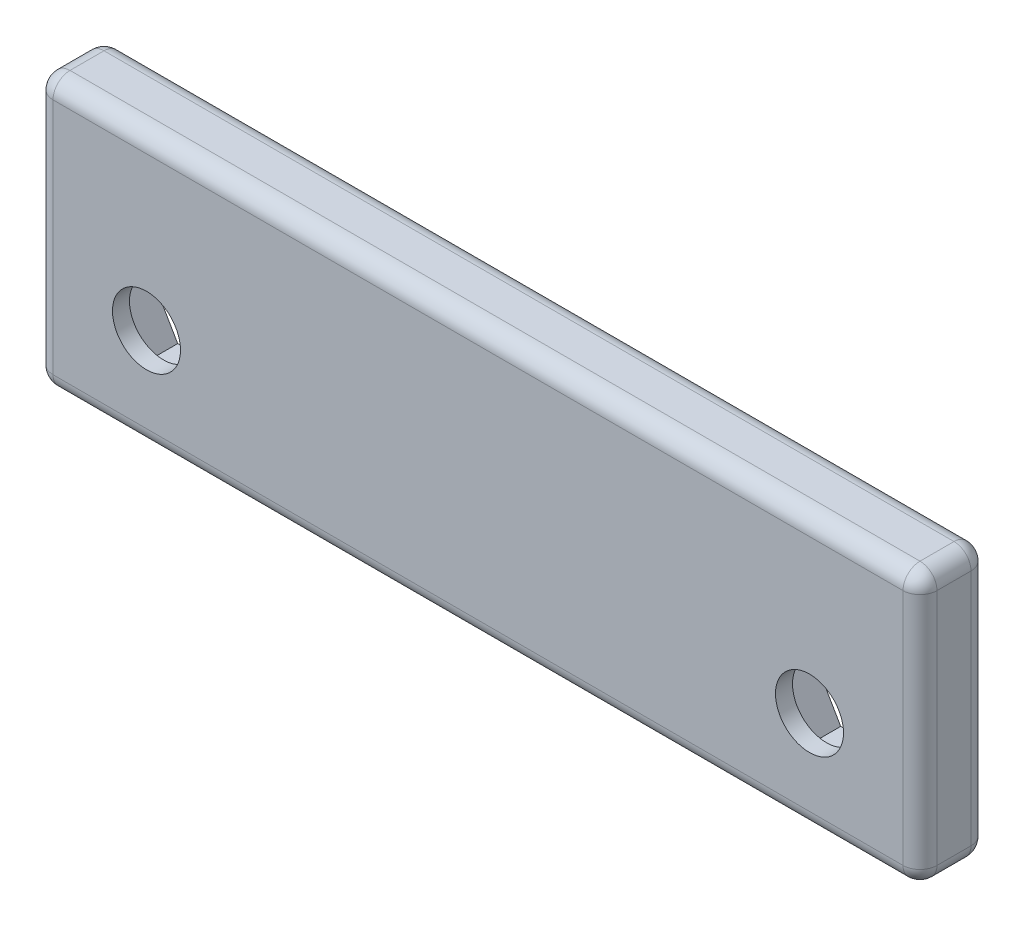
ISO-10303-21;
HEADER;
FILE_DESCRIPTION(('STEP AP214'),'2;1');
FILE_NAME('part.step','',(''),(''),'','','');
FILE_SCHEMA(('AUTOMOTIVE_DESIGN { 1 0 10303 214 1 1 1 1 }'));
ENDSEC;
DATA;
#1=APPLICATION_CONTEXT('core data for automotive mechanical design processes');
#2=APPLICATION_PROTOCOL_DEFINITION('international standard','automotive_design',2000,#1);
#3=PRODUCT_CONTEXT('',#1,'mechanical');
#4=PRODUCT('Part','Part','',(#3));
#5=PRODUCT_RELATED_PRODUCT_CATEGORY('part','',(#4));
#6=PRODUCT_DEFINITION_FORMATION('','',#4);
#7=PRODUCT_DEFINITION_CONTEXT('part definition',#1,'design');
#8=PRODUCT_DEFINITION('design','',#6,#7);
#9=PRODUCT_DEFINITION_SHAPE('','',#8);
#10=(LENGTH_UNIT() NAMED_UNIT(*) SI_UNIT(.MILLI.,.METRE.));
#11=(NAMED_UNIT(*) PLANE_ANGLE_UNIT() SI_UNIT($,.RADIAN.));
#12=(NAMED_UNIT(*) SI_UNIT($,.STERADIAN.) SOLID_ANGLE_UNIT());
#13=UNCERTAINTY_MEASURE_WITH_UNIT(LENGTH_MEASURE(1.E-05),#10,'distance_accuracy_value','');
#14=(GEOMETRIC_REPRESENTATION_CONTEXT(3) GLOBAL_UNCERTAINTY_ASSIGNED_CONTEXT((#13)) GLOBAL_UNIT_ASSIGNED_CONTEXT((#10,
#11,#12)) REPRESENTATION_CONTEXT('',''));
#15=CARTESIAN_POINT('',(0.,0.,0.));
#16=DIRECTION('',(0.,0.,1.));
#17=DIRECTION('',(1.,0.,0.));
#18=AXIS2_PLACEMENT_3D('',#15,#16,#17);
#19=CARTESIAN_POINT('',(-5.64474689882211,-0.29828109962315,4.));
#20=DIRECTION('',(0.,0.,-1.));
#21=DIRECTION('',(-1.,0.,0.));
#22=AXIS2_PLACEMENT_3D('',#19,#20,#21);
#23=CYLINDRICAL_SURFACE('',#22,2.);
#24=CARTESIAN_POINT('',(-5.64474689882211,-0.29828109962315,4.));
#25=DIRECTION('',(0.,0.,1.));
#26=DIRECTION('',(1.,0.,0.));
#27=AXIS2_PLACEMENT_3D('',#24,#25,#26);
#28=CIRCLE('',#27,2.);
#29=CARTESIAN_POINT('',(-3.64474689882211,-0.29828109962315,4.));
#30=VERTEX_POINT('',#29);
#31=EDGE_CURVE('E300',#30,#30,#28,.T.);
#32=ORIENTED_EDGE('',*,*,#31,.T.);
#33=EDGE_LOOP('',(#32));
#34=FACE_BOUND('',#33,.T.);
#35=CARTESIAN_POINT('',(-5.64474689882211,-0.29828109962315,3.));
#36=DIRECTION('',(0.,0.,-1.));
#37=DIRECTION('',(-1.,0.,0.));
#38=AXIS2_PLACEMENT_3D('',#35,#36,#37);
#39=CIRCLE('',#38,2.);
#40=CARTESIAN_POINT('',(-7.64474689882211,-0.29828109962315,3.));
#41=VERTEX_POINT('',#40);
#42=EDGE_CURVE('E37',#41,#41,#39,.T.);
#43=ORIENTED_EDGE('',*,*,#42,.T.);
#44=EDGE_LOOP('',(#43));
#45=FACE_BOUND('',#44,.T.);
#46=ADVANCED_FACE('F33',(#34,#45),#23,.F.);
#47=CARTESIAN_POINT('',(33.3552531011779,-0.298281099623149,4.));
#48=DIRECTION('',(0.,0.,-1.));
#49=DIRECTION('',(-1.,0.,0.));
#50=AXIS2_PLACEMENT_3D('',#47,#48,#49);
#51=CYLINDRICAL_SURFACE('',#50,2.);
#52=CARTESIAN_POINT('',(33.3552531011779,-0.298281099623149,4.));
#53=DIRECTION('',(0.,0.,1.));
#54=DIRECTION('',(1.,0.,0.));
#55=AXIS2_PLACEMENT_3D('',#52,#53,#54);
#56=CIRCLE('',#55,2.);
#57=CARTESIAN_POINT('',(35.3552531011779,-0.298281099623149,4.));
#58=VERTEX_POINT('',#57);
#59=EDGE_CURVE('E297',#58,#58,#56,.T.);
#60=ORIENTED_EDGE('',*,*,#59,.T.);
#61=EDGE_LOOP('',(#60));
#62=FACE_BOUND('',#61,.T.);
#63=CARTESIAN_POINT('',(33.3552531011779,-0.298281099623149,3.));
#64=DIRECTION('',(0.,0.,-1.));
#65=DIRECTION('',(-1.,0.,0.));
#66=AXIS2_PLACEMENT_3D('',#63,#64,#65);
#67=CIRCLE('',#66,2.);
#68=CARTESIAN_POINT('',(31.3552531011779,-0.298281099623149,3.));
#69=VERTEX_POINT('',#68);
#70=EDGE_CURVE('E287',#69,#69,#67,.T.);
#71=ORIENTED_EDGE('',*,*,#70,.T.);
#72=EDGE_LOOP('',(#71));
#73=FACE_BOUND('',#72,.T.);
#74=ADVANCED_FACE('F422',(#62,#73),#51,.F.);
#75=CARTESIAN_POINT('',(0.,0.,4.));
#76=DIRECTION('',(0.,0.,1.));
#77=DIRECTION('',(1.,0.,0.));
#78=AXIS2_PLACEMENT_3D('',#75,#76,#77);
#79=PLANE('',#78);
#80=DIRECTION('',(-1.,0.,0.));
#81=VECTOR('',#80,1.);
#82=CARTESIAN_POINT('',(-12.1447468988221,8.70171890037685,4.));
#83=LINE('',#82,#81);
#84=CARTESIAN_POINT('',(38.8552531011779,8.70171890037685,4.));
#85=VERTEX_POINT('',#84);
#86=CARTESIAN_POINT('',(-11.1447468988221,8.70171890037685,4.));
#87=VERTEX_POINT('',#86);
#88=EDGE_CURVE('E331',#85,#87,#83,.T.);
#89=ORIENTED_EDGE('',*,*,#88,.T.);
#90=DIRECTION('',(0.,-1.,0.));
#91=VECTOR('',#90,1.);
#92=CARTESIAN_POINT('',(-11.1447468988221,-6.29828109962315,4.));
#93=LINE('',#92,#91);
#94=CARTESIAN_POINT('',(-11.1447468988221,-5.29828109962315,4.));
#95=VERTEX_POINT('',#94);
#96=EDGE_CURVE('E337',#87,#95,#93,.T.);
#97=ORIENTED_EDGE('',*,*,#96,.T.);
#98=DIRECTION('',(1.,0.,0.));
#99=VECTOR('',#98,1.);
#100=CARTESIAN_POINT('',(39.8552531011779,-5.29828109962315,4.));
#101=LINE('',#100,#99);
#102=CARTESIAN_POINT('',(38.8552531011779,-5.29828109962315,4.));
#103=VERTEX_POINT('',#102);
#104=EDGE_CURVE('E335',#95,#103,#101,.T.);
#105=ORIENTED_EDGE('',*,*,#104,.T.);
#106=DIRECTION('',(0.,1.,0.));
#107=VECTOR('',#106,1.);
#108=CARTESIAN_POINT('',(38.8552531011779,9.70171890037685,4.));
#109=LINE('',#108,#107);
#110=EDGE_CURVE('E333',#103,#85,#109,.T.);
#111=ORIENTED_EDGE('',*,*,#110,.T.);
#112=EDGE_LOOP('',(#89,#97,#105,#111));
#113=FACE_BOUND('',#112,.T.);
#114=ORIENTED_EDGE('',*,*,#31,.F.);
#115=EDGE_LOOP('',(#114));
#116=FACE_BOUND('',#115,.T.);
#117=ORIENTED_EDGE('',*,*,#59,.F.);
#118=EDGE_LOOP('',(#117));
#119=FACE_BOUND('',#118,.T.);
#120=ADVANCED_FACE('F455',(#113,#116,#119),#79,.T.);
#121=CARTESIAN_POINT('',(0.,0.,0.));
#122=DIRECTION('',(0.,0.,1.));
#123=DIRECTION('',(1.,0.,0.));
#124=AXIS2_PLACEMENT_3D('',#121,#122,#123);
#125=PLANE('',#124);
#126=DIRECTION('',(-0.5,-0.866025403784439,0.));
#127=VECTOR('',#126,1.);
#128=CARTESIAN_POINT('',(-1.31461987989992,-0.298281099623151,0.));
#129=LINE('',#128,#127);
#130=CARTESIAN_POINT('',(-1.31461987989992,-0.298281099623151,0.));
#131=VERTEX_POINT('',#130);
#132=CARTESIAN_POINT('',(-3.47968338936101,-4.04828109962315,0.));
#133=VERTEX_POINT('',#132);
#134=EDGE_CURVE('E231',#131,#133,#129,.T.);
#135=ORIENTED_EDGE('',*,*,#134,.F.);
#136=DIRECTION('',(0.5,-0.866025403784439,0.));
#137=VECTOR('',#136,1.);
#138=CARTESIAN_POINT('',(-3.47968338936101,3.45171890037685,0.));
#139=LINE('',#138,#137);
#140=CARTESIAN_POINT('',(-3.47968338936101,3.45171890037685,0.));
#141=VERTEX_POINT('',#140);
#142=EDGE_CURVE('E50',#141,#131,#139,.T.);
#143=ORIENTED_EDGE('',*,*,#142,.F.);
#144=DIRECTION('',(1.,0.,0.));
#145=VECTOR('',#144,1.);
#146=CARTESIAN_POINT('',(-7.8098104082832,3.45171890037685,0.));
#147=LINE('',#146,#145);
#148=CARTESIAN_POINT('',(-7.8098104082832,3.45171890037685,0.));
#149=VERTEX_POINT('',#148);
#150=EDGE_CURVE('E217',#149,#141,#147,.T.);
#151=ORIENTED_EDGE('',*,*,#150,.F.);
#152=DIRECTION('',(0.5,0.866025403784439,0.));
#153=VECTOR('',#152,1.);
#154=CARTESIAN_POINT('',(-9.9748739177443,-0.298281099623149,0.));
#155=LINE('',#154,#153);
#156=CARTESIAN_POINT('',(-9.9748739177443,-0.298281099623149,0.));
#157=VERTEX_POINT('',#156);
#158=EDGE_CURVE('E220',#157,#149,#155,.T.);
#159=ORIENTED_EDGE('',*,*,#158,.F.);
#160=DIRECTION('',(-0.5,0.866025403784439,0.));
#161=VECTOR('',#160,1.);
#162=CARTESIAN_POINT('',(-7.8098104082832,-4.04828109962315,0.));
#163=LINE('',#162,#161);
#164=CARTESIAN_POINT('',(-7.8098104082832,-4.04828109962315,0.));
#165=VERTEX_POINT('',#164);
#166=EDGE_CURVE('E236',#165,#157,#163,.T.);
#167=ORIENTED_EDGE('',*,*,#166,.F.);
#168=DIRECTION('',(-1.,0.,0.));
#169=VECTOR('',#168,1.);
#170=CARTESIAN_POINT('',(-3.47968338936101,-4.04828109962315,0.));
#171=LINE('',#170,#169);
#172=EDGE_CURVE('E233',#133,#165,#171,.T.);
#173=ORIENTED_EDGE('',*,*,#172,.F.);
#174=EDGE_LOOP('',(#135,#143,#151,#159,#167,#173));
#175=FACE_BOUND('',#174,.T.);
#176=DIRECTION('',(0.5,0.866025403784439,0.));
#177=VECTOR('',#176,1.);
#178=CARTESIAN_POINT('',(29.0251260822557,-0.298281099623142,0.));
#179=LINE('',#178,#177);
#180=CARTESIAN_POINT('',(29.0251260822557,-0.298281099623142,0.));
#181=VERTEX_POINT('',#180);
#182=CARTESIAN_POINT('',(31.1901895917168,3.45171890037685,0.));
#183=VERTEX_POINT('',#182);
#184=EDGE_CURVE('E271',#181,#183,#179,.T.);
#185=ORIENTED_EDGE('',*,*,#184,.F.);
#186=DIRECTION('',(-0.499999999999999,0.866025403784439,0.));
#187=VECTOR('',#186,1.);
#188=CARTESIAN_POINT('',(31.1901895917168,-4.04828109962314,0.));
#189=LINE('',#188,#187);
#190=CARTESIAN_POINT('',(31.1901895917168,-4.04828109962314,0.));
#191=VERTEX_POINT('',#190);
#192=EDGE_CURVE('E58',#191,#181,#189,.T.);
#193=ORIENTED_EDGE('',*,*,#192,.F.);
#194=DIRECTION('',(-1.,0.,0.));
#195=VECTOR('',#194,1.);
#196=CARTESIAN_POINT('',(35.520316610639,-4.04828109962314,0.));
#197=LINE('',#196,#195);
#198=CARTESIAN_POINT('',(35.520316610639,-4.04828109962314,0.));
#199=VERTEX_POINT('',#198);
#200=EDGE_CURVE('E254',#199,#191,#197,.T.);
#201=ORIENTED_EDGE('',*,*,#200,.F.);
#202=DIRECTION('',(-0.5,-0.866025403784439,0.));
#203=VECTOR('',#202,1.);
#204=CARTESIAN_POINT('',(37.6853801201001,-0.298281099623148,0.));
#205=LINE('',#204,#203);
#206=CARTESIAN_POINT('',(37.6853801201001,-0.298281099623148,0.));
#207=VERTEX_POINT('',#206);
#208=EDGE_CURVE('E280',#207,#199,#205,.T.);
#209=ORIENTED_EDGE('',*,*,#208,.F.);
#210=DIRECTION('',(0.5,-0.866025403784439,0.));
#211=VECTOR('',#210,1.);
#212=CARTESIAN_POINT('',(35.520316610639,3.45171890037685,0.));
#213=LINE('',#212,#211);
#214=CARTESIAN_POINT('',(35.520316610639,3.45171890037685,0.));
#215=VERTEX_POINT('',#214);
#216=EDGE_CURVE('E277',#215,#207,#213,.T.);
#217=ORIENTED_EDGE('',*,*,#216,.F.);
#218=DIRECTION('',(1.,0.,0.));
#219=VECTOR('',#218,1.);
#220=CARTESIAN_POINT('',(31.1901895917168,3.45171890037685,0.));
#221=LINE('',#220,#219);
#222=EDGE_CURVE('E274',#183,#215,#221,.T.);
#223=ORIENTED_EDGE('',*,*,#222,.F.);
#224=EDGE_LOOP('',(#185,#193,#201,#209,#217,#223));
#225=FACE_BOUND('',#224,.T.);
#226=DIRECTION('',(1.,0.,0.));
#227=VECTOR('',#226,1.);
#228=CARTESIAN_POINT('',(0.,-5.29828109962315,0.));
#229=LINE('',#228,#227);
#230=CARTESIAN_POINT('',(38.8552531011779,-5.29828109962315,0.));
#231=VERTEX_POINT('',#230);
#232=CARTESIAN_POINT('',(-11.1447468988221,-5.29828109962315,0.));
#233=VERTEX_POINT('',#232);
#234=EDGE_CURVE('E326',#231,#233,#229,.F.);
#235=ORIENTED_EDGE('',*,*,#234,.T.);
#236=DIRECTION('',(0.,-1.,0.));
#237=VECTOR('',#236,1.);
#238=CARTESIAN_POINT('',(-11.1447468988221,0.,0.));
#239=LINE('',#238,#237);
#240=CARTESIAN_POINT('',(-11.1447468988221,8.70171890037685,0.));
#241=VERTEX_POINT('',#240);
#242=EDGE_CURVE('E328',#233,#241,#239,.F.);
#243=ORIENTED_EDGE('',*,*,#242,.T.);
#244=DIRECTION('',(-1.,0.,0.));
#245=VECTOR('',#244,1.);
#246=CARTESIAN_POINT('',(0.,8.70171890037685,0.));
#247=LINE('',#246,#245);
#248=CARTESIAN_POINT('',(38.8552531011779,8.70171890037685,0.));
#249=VERTEX_POINT('',#248);
#250=EDGE_CURVE('E322',#241,#249,#247,.F.);
#251=ORIENTED_EDGE('',*,*,#250,.T.);
#252=DIRECTION('',(0.,1.,0.));
#253=VECTOR('',#252,1.);
#254=CARTESIAN_POINT('',(38.8552531011779,0.,0.));
#255=LINE('',#254,#253);
#256=EDGE_CURVE('E324',#249,#231,#255,.F.);
#257=ORIENTED_EDGE('',*,*,#256,.T.);
#258=EDGE_LOOP('',(#235,#243,#251,#257));
#259=FACE_BOUND('',#258,.T.);
#260=ADVANCED_FACE('F451',(#175,#225,#259),#125,.F.);
#261=CARTESIAN_POINT('',(-12.1447468988221,9.70171890037685,4.));
#262=DIRECTION('',(1.,0.,0.));
#263=DIRECTION('',(0.,1.,0.));
#264=AXIS2_PLACEMENT_3D('',#261,#262,#263);
#265=PLANE('',#264);
#266=DIRECTION('',(0.,-1.,0.));
#267=VECTOR('',#266,1.);
#268=CARTESIAN_POINT('',(-12.1447468988221,9.70171890037685,3.));
#269=LINE('',#268,#267);
#270=CARTESIAN_POINT('',(-12.1447468988221,-5.29828109962315,3.));
#271=VERTEX_POINT('',#270);
#272=CARTESIAN_POINT('',(-12.1447468988221,8.70171890037685,3.));
#273=VERTEX_POINT('',#272);
#274=EDGE_CURVE('E306',#271,#273,#269,.F.);
#275=ORIENTED_EDGE('',*,*,#274,.T.);
#276=DIRECTION('',(0.,0.,-1.));
#277=VECTOR('',#276,1.);
#278=CARTESIAN_POINT('',(-12.1447468988221,8.70171890037685,4.));
#279=LINE('',#278,#277);
#280=CARTESIAN_POINT('',(-12.1447468988221,8.70171890037685,1.));
#281=VERTEX_POINT('',#280);
#282=EDGE_CURVE('E310',#273,#281,#279,.T.);
#283=ORIENTED_EDGE('',*,*,#282,.T.);
#284=DIRECTION('',(0.,-1.,0.));
#285=VECTOR('',#284,1.);
#286=CARTESIAN_POINT('',(-12.1447468988221,9.70171890037685,1.));
#287=LINE('',#286,#285);
#288=CARTESIAN_POINT('',(-12.1447468988221,-5.29828109962315,1.));
#289=VERTEX_POINT('',#288);
#290=EDGE_CURVE('E308',#281,#289,#287,.T.);
#291=ORIENTED_EDGE('',*,*,#290,.T.);
#292=DIRECTION('',(0.,0.,-1.));
#293=VECTOR('',#292,1.);
#294=CARTESIAN_POINT('',(-12.1447468988221,-5.29828109962315,4.));
#295=LINE('',#294,#293);
#296=EDGE_CURVE('E304',#289,#271,#295,.F.);
#297=ORIENTED_EDGE('',*,*,#296,.T.);
#298=EDGE_LOOP('',(#275,#283,#291,#297));
#299=FACE_BOUND('',#298,.T.);
#300=ADVANCED_FACE('F454',(#299),#265,.F.);
#301=CARTESIAN_POINT('',(-12.1447468988221,-6.29828109962315,4.));
#302=DIRECTION('',(0.,1.,0.));
#303=DIRECTION('',(0.,0.,1.));
#304=AXIS2_PLACEMENT_3D('',#301,#302,#303);
#305=PLANE('',#304);
#306=DIRECTION('',(1.,0.,0.));
#307=VECTOR('',#306,1.);
#308=CARTESIAN_POINT('',(-12.1447468988221,-6.29828109962315,3.));
#309=LINE('',#308,#307);
#310=CARTESIAN_POINT('',(38.8552531011779,-6.29828109962315,3.));
#311=VERTEX_POINT('',#310);
#312=CARTESIAN_POINT('',(-11.1447468988221,-6.29828109962315,3.));
#313=VERTEX_POINT('',#312);
#314=EDGE_CURVE('E342',#311,#313,#309,.F.);
#315=ORIENTED_EDGE('',*,*,#314,.T.);
#316=DIRECTION('',(0.,0.,-1.));
#317=VECTOR('',#316,1.);
#318=CARTESIAN_POINT('',(-11.1447468988221,-6.29828109962315,4.));
#319=LINE('',#318,#317);
#320=CARTESIAN_POINT('',(-11.1447468988221,-6.29828109962315,1.));
#321=VERTEX_POINT('',#320);
#322=EDGE_CURVE('E346',#313,#321,#319,.T.);
#323=ORIENTED_EDGE('',*,*,#322,.T.);
#324=DIRECTION('',(1.,0.,0.));
#325=VECTOR('',#324,1.);
#326=CARTESIAN_POINT('',(-12.1447468988221,-6.29828109962315,1.));
#327=LINE('',#326,#325);
#328=CARTESIAN_POINT('',(38.8552531011779,-6.29828109962315,1.));
#329=VERTEX_POINT('',#328);
#330=EDGE_CURVE('E344',#321,#329,#327,.T.);
#331=ORIENTED_EDGE('',*,*,#330,.T.);
#332=DIRECTION('',(0.,0.,-1.));
#333=VECTOR('',#332,1.);
#334=CARTESIAN_POINT('',(38.8552531011779,-6.29828109962315,4.));
#335=LINE('',#334,#333);
#336=EDGE_CURVE('E340',#329,#311,#335,.F.);
#337=ORIENTED_EDGE('',*,*,#336,.T.);
#338=EDGE_LOOP('',(#315,#323,#331,#337));
#339=FACE_BOUND('',#338,.T.);
#340=ADVANCED_FACE('F543',(#339),#305,.F.);
#341=CARTESIAN_POINT('',(39.8552531011779,9.70171890037685,4.));
#342=DIRECTION('',(-1.,0.,0.));
#343=DIRECTION('',(0.,0.,1.));
#344=AXIS2_PLACEMENT_3D('',#341,#342,#343);
#345=PLANE('',#344);
#346=DIRECTION('',(0.,1.,0.));
#347=VECTOR('',#346,1.);
#348=CARTESIAN_POINT('',(39.8552531011779,-6.29828109962315,3.));
#349=LINE('',#348,#347);
#350=CARTESIAN_POINT('',(39.8552531011779,8.70171890037685,3.));
#351=VERTEX_POINT('',#350);
#352=CARTESIAN_POINT('',(39.8552531011779,-5.29828109962315,3.));
#353=VERTEX_POINT('',#352);
#354=EDGE_CURVE('E351',#351,#353,#349,.F.);
#355=ORIENTED_EDGE('',*,*,#354,.T.);
#356=DIRECTION('',(0.,0.,-1.));
#357=VECTOR('',#356,1.);
#358=CARTESIAN_POINT('',(39.8552531011779,-5.29828109962315,4.));
#359=LINE('',#358,#357);
#360=CARTESIAN_POINT('',(39.8552531011779,-5.29828109962315,1.));
#361=VERTEX_POINT('',#360);
#362=EDGE_CURVE('E11',#353,#361,#359,.T.);
#363=ORIENTED_EDGE('',*,*,#362,.T.);
#364=DIRECTION('',(0.,1.,0.));
#365=VECTOR('',#364,1.);
#366=CARTESIAN_POINT('',(39.8552531011779,9.70171890037685,1.));
#367=LINE('',#366,#365);
#368=CARTESIAN_POINT('',(39.8552531011779,8.70171890037685,1.));
#369=VERTEX_POINT('',#368);
#370=EDGE_CURVE('E42',#361,#369,#367,.T.);
#371=ORIENTED_EDGE('',*,*,#370,.T.);
#372=DIRECTION('',(0.,0.,-1.));
#373=VECTOR('',#372,1.);
#374=CARTESIAN_POINT('',(39.8552531011779,8.70171890037685,4.));
#375=LINE('',#374,#373);
#376=EDGE_CURVE('E349',#369,#351,#375,.F.);
#377=ORIENTED_EDGE('',*,*,#376,.T.);
#378=EDGE_LOOP('',(#355,#363,#371,#377));
#379=FACE_BOUND('',#378,.T.);
#380=ADVANCED_FACE('F497',(#379),#345,.F.);
#381=CARTESIAN_POINT('',(-12.1447468988221,9.70171890037685,4.));
#382=DIRECTION('',(0.,-1.,0.));
#383=DIRECTION('',(1.,0.,0.));
#384=AXIS2_PLACEMENT_3D('',#381,#382,#383);
#385=PLANE('',#384);
#386=DIRECTION('',(0.,0.,-1.));
#387=VECTOR('',#386,1.);
#388=CARTESIAN_POINT('',(38.8552531011779,9.70171890037685,4.));
#389=LINE('',#388,#387);
#390=CARTESIAN_POINT('',(38.8552531011779,9.70171890037685,3.));
#391=VERTEX_POINT('',#390);
#392=CARTESIAN_POINT('',(38.8552531011779,9.70171890037685,1.));
#393=VERTEX_POINT('',#392);
#394=EDGE_CURVE('E315',#391,#393,#389,.T.);
#395=ORIENTED_EDGE('',*,*,#394,.T.);
#396=DIRECTION('',(-1.,0.,0.));
#397=VECTOR('',#396,1.);
#398=CARTESIAN_POINT('',(-12.1447468988221,9.70171890037685,1.));
#399=LINE('',#398,#397);
#400=CARTESIAN_POINT('',(-11.1447468988221,9.70171890037685,1.));
#401=VERTEX_POINT('',#400);
#402=EDGE_CURVE('E320',#393,#401,#399,.T.);
#403=ORIENTED_EDGE('',*,*,#402,.T.);
#404=DIRECTION('',(0.,0.,-1.));
#405=VECTOR('',#404,1.);
#406=CARTESIAN_POINT('',(-11.1447468988221,9.70171890037685,4.));
#407=LINE('',#406,#405);
#408=CARTESIAN_POINT('',(-11.1447468988221,9.70171890037685,3.));
#409=VERTEX_POINT('',#408);
#410=EDGE_CURVE('E317',#401,#409,#407,.F.);
#411=ORIENTED_EDGE('',*,*,#410,.T.);
#412=DIRECTION('',(-1.,0.,0.));
#413=VECTOR('',#412,1.);
#414=CARTESIAN_POINT('',(39.8552531011779,9.70171890037685,3.));
#415=LINE('',#414,#413);
#416=EDGE_CURVE('E313',#409,#391,#415,.F.);
#417=ORIENTED_EDGE('',*,*,#416,.T.);
#418=EDGE_LOOP('',(#395,#403,#411,#417));
#419=FACE_BOUND('',#418,.T.);
#420=ADVANCED_FACE('F537',(#419),#385,.F.);
#421=CARTESIAN_POINT('',(38.8552531011779,-5.29828109962315,4.));
#422=DIRECTION('',(0.,0.,-1.));
#423=DIRECTION('',(-1.,0.,0.));
#424=AXIS2_PLACEMENT_3D('',#421,#422,#423);
#425=CYLINDRICAL_SURFACE('',#424,1.);
#426=CARTESIAN_POINT('',(38.8552531011779,-5.29828109962315,3.));
#427=DIRECTION('',(0.,0.,1.));
#428=DIRECTION('',(1.,0.,0.));
#429=AXIS2_PLACEMENT_3D('',#426,#427,#428);
#430=CIRCLE('',#429,1.);
#431=EDGE_CURVE('E301',#311,#353,#430,.T.);
#432=ORIENTED_EDGE('',*,*,#431,.F.);
#433=ORIENTED_EDGE('',*,*,#336,.F.);
#434=CARTESIAN_POINT('',(38.8552531011779,-5.29828109962315,1.));
#435=DIRECTION('',(0.,0.,-1.));
#436=DIRECTION('',(-1.,0.,0.));
#437=AXIS2_PLACEMENT_3D('',#434,#435,#436);
#438=CIRCLE('',#437,1.);
#439=EDGE_CURVE('E415',#361,#329,#438,.T.);
#440=ORIENTED_EDGE('',*,*,#439,.F.);
#441=ORIENTED_EDGE('',*,*,#362,.F.);
#442=EDGE_LOOP('',(#432,#433,#440,#441));
#443=FACE_BOUND('',#442,.T.);
#444=ADVANCED_FACE('F35',(#443),#425,.T.);
#445=CARTESIAN_POINT('',(38.8552531011779,-5.29828109962315,3.));
#446=DIRECTION('',(0.,0.,1.));
#447=DIRECTION('',(1.,0.,0.));
#448=AXIS2_PLACEMENT_3D('',#445,#446,#447);
#449=SPHERICAL_SURFACE('',#448,1.);
#450=CARTESIAN_POINT('',(38.8552531011779,-5.29828109962315,3.));
#451=DIRECTION('',(1.,0.,0.));
#452=DIRECTION('',(0.,0.,-1.));
#453=AXIS2_PLACEMENT_3D('',#450,#451,#452);
#454=CIRCLE('',#453,1.);
#455=EDGE_CURVE('E409',#311,#103,#454,.F.);
#456=ORIENTED_EDGE('',*,*,#455,.F.);
#457=ORIENTED_EDGE('',*,*,#431,.T.);
#458=CARTESIAN_POINT('',(38.8552531011779,-5.29828109962315,3.));
#459=DIRECTION('',(0.,-1.,0.));
#460=DIRECTION('',(0.,0.,-1.));
#461=AXIS2_PLACEMENT_3D('',#458,#459,#460);
#462=CIRCLE('',#461,1.);
#463=EDGE_CURVE('E412',#103,#353,#462,.F.);
#464=ORIENTED_EDGE('',*,*,#463,.F.);
#465=EDGE_LOOP('',(#456,#457,#464));
#466=FACE_BOUND('',#465,.T.);
#467=ADVANCED_FACE('F507',(#466),#449,.T.);
#468=CARTESIAN_POINT('',(38.8552531011779,-5.29828109962315,1.));
#469=DIRECTION('',(0.,0.,1.));
#470=DIRECTION('',(1.,0.,0.));
#471=AXIS2_PLACEMENT_3D('',#468,#469,#470);
#472=SPHERICAL_SURFACE('',#471,1.);
#473=CARTESIAN_POINT('',(38.8552531011779,-5.29828109962315,1.));
#474=DIRECTION('',(0.,-1.,0.));
#475=DIRECTION('',(1.,0.,0.));
#476=AXIS2_PLACEMENT_3D('',#473,#474,#475);
#477=CIRCLE('',#476,1.);
#478=EDGE_CURVE('E403',#361,#231,#477,.F.);
#479=ORIENTED_EDGE('',*,*,#478,.F.);
#480=ORIENTED_EDGE('',*,*,#439,.T.);
#481=CARTESIAN_POINT('',(38.8552531011779,-5.29828109962315,1.));
#482=DIRECTION('',(1.,0.,0.));
#483=DIRECTION('',(0.,0.,-1.));
#484=AXIS2_PLACEMENT_3D('',#481,#482,#483);
#485=CIRCLE('',#484,1.);
#486=EDGE_CURVE('E406',#231,#329,#485,.F.);
#487=ORIENTED_EDGE('',*,*,#486,.F.);
#488=EDGE_LOOP('',(#479,#480,#487));
#489=FACE_BOUND('',#488,.T.);
#490=ADVANCED_FACE('F514',(#489),#472,.T.);
#491=CARTESIAN_POINT('',(38.8552531011779,0.,3.));
#492=DIRECTION('',(0.,-1.,0.));
#493=DIRECTION('',(0.,0.,-1.));
#494=AXIS2_PLACEMENT_3D('',#491,#492,#493);
#495=CYLINDRICAL_SURFACE('',#494,1.);
#496=ORIENTED_EDGE('',*,*,#463,.T.);
#497=ORIENTED_EDGE('',*,*,#354,.F.);
#498=CARTESIAN_POINT('',(38.8552531011779,8.70171890037685,3.));
#499=DIRECTION('',(0.,1.,0.));
#500=DIRECTION('',(0.,0.,1.));
#501=AXIS2_PLACEMENT_3D('',#498,#499,#500);
#502=CIRCLE('',#501,1.);
#503=EDGE_CURVE('E397',#85,#351,#502,.T.);
#504=ORIENTED_EDGE('',*,*,#503,.F.);
#505=ORIENTED_EDGE('',*,*,#110,.F.);
#506=EDGE_LOOP('',(#496,#497,#504,#505));
#507=FACE_BOUND('',#506,.T.);
#508=ADVANCED_FACE('F501',(#507),#495,.T.);
#509=CARTESIAN_POINT('',(0.,-5.29828109962315,3.));
#510=DIRECTION('',(-1.,0.,0.));
#511=DIRECTION('',(0.,0.,1.));
#512=AXIS2_PLACEMENT_3D('',#509,#510,#511);
#513=CYLINDRICAL_SURFACE('',#512,1.);
#514=ORIENTED_EDGE('',*,*,#455,.T.);
#515=ORIENTED_EDGE('',*,*,#104,.F.);
#516=CARTESIAN_POINT('',(-11.1447468988221,-5.29828109962315,3.));
#517=DIRECTION('',(-1.,0.,0.));
#518=DIRECTION('',(0.,0.,1.));
#519=AXIS2_PLACEMENT_3D('',#516,#517,#518);
#520=CIRCLE('',#519,1.);
#521=EDGE_CURVE('E394',#313,#95,#520,.T.);
#522=ORIENTED_EDGE('',*,*,#521,.F.);
#523=ORIENTED_EDGE('',*,*,#314,.F.);
#524=EDGE_LOOP('',(#514,#515,#522,#523));
#525=FACE_BOUND('',#524,.T.);
#526=ADVANCED_FACE('F521',(#525),#513,.T.);
#527=CARTESIAN_POINT('',(-11.1447468988221,-5.29828109962315,4.));
#528=DIRECTION('',(0.,0.,-1.));
#529=DIRECTION('',(-1.,0.,0.));
#530=AXIS2_PLACEMENT_3D('',#527,#528,#529);
#531=CYLINDRICAL_SURFACE('',#530,1.);
#532=CARTESIAN_POINT('',(-11.1447468988221,-5.29828109962315,1.));
#533=DIRECTION('',(0.,0.,-1.));
#534=DIRECTION('',(-1.,0.,0.));
#535=AXIS2_PLACEMENT_3D('',#532,#533,#534);
#536=CIRCLE('',#535,1.);
#537=EDGE_CURVE('E388',#321,#289,#536,.T.);
#538=ORIENTED_EDGE('',*,*,#537,.F.);
#539=ORIENTED_EDGE('',*,*,#322,.F.);
#540=CARTESIAN_POINT('',(-11.1447468988221,-5.29828109962315,3.));
#541=DIRECTION('',(0.,0.,1.));
#542=DIRECTION('',(1.,0.,0.));
#543=AXIS2_PLACEMENT_3D('',#540,#541,#542);
#544=CIRCLE('',#543,1.);
#545=EDGE_CURVE('E391',#271,#313,#544,.T.);
#546=ORIENTED_EDGE('',*,*,#545,.F.);
#547=ORIENTED_EDGE('',*,*,#296,.F.);
#548=EDGE_LOOP('',(#538,#539,#546,#547));
#549=FACE_BOUND('',#548,.T.);
#550=ADVANCED_FACE('F591',(#549),#531,.T.);
#551=CARTESIAN_POINT('',(-12.1447468988221,-5.29828109962315,1.));
#552=DIRECTION('',(1.,0.,0.));
#553=DIRECTION('',(0.,0.,-1.));
#554=AXIS2_PLACEMENT_3D('',#551,#552,#553);
#555=CYLINDRICAL_SURFACE('',#554,1.);
#556=ORIENTED_EDGE('',*,*,#486,.T.);
#557=ORIENTED_EDGE('',*,*,#330,.F.);
#558=CARTESIAN_POINT('',(-11.1447468988221,-5.29828109962315,1.));
#559=DIRECTION('',(-1.,0.,0.));
#560=DIRECTION('',(0.,0.,1.));
#561=AXIS2_PLACEMENT_3D('',#558,#559,#560);
#562=CIRCLE('',#561,1.);
#563=EDGE_CURVE('E386',#233,#321,#562,.T.);
#564=ORIENTED_EDGE('',*,*,#563,.F.);
#565=ORIENTED_EDGE('',*,*,#234,.F.);
#566=EDGE_LOOP('',(#556,#557,#564,#565));
#567=FACE_BOUND('',#566,.T.);
#568=ADVANCED_FACE('F465',(#567),#555,.T.);
#569=CARTESIAN_POINT('',(38.8552531011779,9.70171890037685,1.));
#570=DIRECTION('',(0.,1.,0.));
#571=DIRECTION('',(0.,0.,1.));
#572=AXIS2_PLACEMENT_3D('',#569,#570,#571);
#573=CYLINDRICAL_SURFACE('',#572,1.);
#574=ORIENTED_EDGE('',*,*,#478,.T.);
#575=ORIENTED_EDGE('',*,*,#256,.F.);
#576=CARTESIAN_POINT('',(38.8552531011779,8.70171890037685,1.));
#577=DIRECTION('',(0.,1.,0.));
#578=DIRECTION('',(0.,0.,1.));
#579=AXIS2_PLACEMENT_3D('',#576,#577,#578);
#580=CIRCLE('',#579,1.);
#581=EDGE_CURVE('E383',#369,#249,#580,.T.);
#582=ORIENTED_EDGE('',*,*,#581,.F.);
#583=ORIENTED_EDGE('',*,*,#370,.F.);
#584=EDGE_LOOP('',(#574,#575,#582,#583));
#585=FACE_BOUND('',#584,.T.);
#586=ADVANCED_FACE('F484',(#585),#573,.T.);
#587=CARTESIAN_POINT('',(38.8552531011779,8.70171890037685,4.));
#588=DIRECTION('',(0.,0.,-1.));
#589=DIRECTION('',(-1.,0.,0.));
#590=AXIS2_PLACEMENT_3D('',#587,#588,#589);
#591=CYLINDRICAL_SURFACE('',#590,1.);
#592=CARTESIAN_POINT('',(38.8552531011779,8.70171890037685,3.));
#593=DIRECTION('',(0.,0.,1.));
#594=DIRECTION('',(1.,0.,0.));
#595=AXIS2_PLACEMENT_3D('',#592,#593,#594);
#596=CIRCLE('',#595,1.);
#597=EDGE_CURVE('E400',#351,#391,#596,.T.);
#598=ORIENTED_EDGE('',*,*,#597,.F.);
#599=ORIENTED_EDGE('',*,*,#376,.F.);
#600=CARTESIAN_POINT('',(38.8552531011779,8.70171890037685,1.));
#601=DIRECTION('',(0.,0.,-1.));
#602=DIRECTION('',(-1.,0.,0.));
#603=AXIS2_PLACEMENT_3D('',#600,#601,#602);
#604=CIRCLE('',#603,1.);
#605=EDGE_CURVE('E380',#393,#369,#604,.T.);
#606=ORIENTED_EDGE('',*,*,#605,.F.);
#607=ORIENTED_EDGE('',*,*,#394,.F.);
#608=EDGE_LOOP('',(#598,#599,#606,#607));
#609=FACE_BOUND('',#608,.T.);
#610=ADVANCED_FACE('F494',(#609),#591,.T.);
#611=CARTESIAN_POINT('',(38.8552531011779,8.70171890037685,3.));
#612=DIRECTION('',(0.,0.,1.));
#613=DIRECTION('',(1.,0.,0.));
#614=AXIS2_PLACEMENT_3D('',#611,#612,#613);
#615=SPHERICAL_SURFACE('',#614,1.);
#616=ORIENTED_EDGE('',*,*,#503,.T.);
#617=ORIENTED_EDGE('',*,*,#597,.T.);
#618=CARTESIAN_POINT('',(38.8552531011779,8.70171890037685,3.));
#619=DIRECTION('',(1.,0.,0.));
#620=DIRECTION('',(0.,0.,-1.));
#621=AXIS2_PLACEMENT_3D('',#618,#619,#620);
#622=CIRCLE('',#621,1.);
#623=EDGE_CURVE('E377',#85,#391,#622,.F.);
#624=ORIENTED_EDGE('',*,*,#623,.F.);
#625=EDGE_LOOP('',(#616,#617,#624));
#626=FACE_BOUND('',#625,.T.);
#627=ADVANCED_FACE('F580',(#626),#615,.T.);
#628=CARTESIAN_POINT('',(-11.1447468988221,-5.29828109962315,3.));
#629=DIRECTION('',(0.,0.,1.));
#630=DIRECTION('',(1.,0.,0.));
#631=AXIS2_PLACEMENT_3D('',#628,#629,#630);
#632=SPHERICAL_SURFACE('',#631,1.);
#633=ORIENTED_EDGE('',*,*,#545,.T.);
#634=ORIENTED_EDGE('',*,*,#521,.T.);
#635=CARTESIAN_POINT('',(-11.1447468988221,-5.29828109962315,3.));
#636=DIRECTION('',(0.,-1.,0.));
#637=DIRECTION('',(0.,0.,-1.));
#638=AXIS2_PLACEMENT_3D('',#635,#636,#637);
#639=CIRCLE('',#638,1.);
#640=EDGE_CURVE('E375',#271,#95,#639,.F.);
#641=ORIENTED_EDGE('',*,*,#640,.F.);
#642=EDGE_LOOP('',(#633,#634,#641));
#643=FACE_BOUND('',#642,.T.);
#644=ADVANCED_FACE('F577',(#643),#632,.T.);
#645=CARTESIAN_POINT('',(-11.1447468988221,-5.29828109962315,1.));
#646=DIRECTION('',(0.,0.,1.));
#647=DIRECTION('',(1.,0.,0.));
#648=AXIS2_PLACEMENT_3D('',#645,#646,#647);
#649=SPHERICAL_SURFACE('',#648,1.);
#650=ORIENTED_EDGE('',*,*,#563,.T.);
#651=ORIENTED_EDGE('',*,*,#537,.T.);
#652=CARTESIAN_POINT('',(-11.1447468988221,-5.29828109962315,1.));
#653=DIRECTION('',(0.,-1.,0.));
#654=DIRECTION('',(0.,0.,-1.));
#655=AXIS2_PLACEMENT_3D('',#652,#653,#654);
#656=CIRCLE('',#655,1.);
#657=EDGE_CURVE('E372',#233,#289,#656,.F.);
#658=ORIENTED_EDGE('',*,*,#657,.F.);
#659=EDGE_LOOP('',(#650,#651,#658));
#660=FACE_BOUND('',#659,.T.);
#661=ADVANCED_FACE('F468',(#660),#649,.T.);
#662=CARTESIAN_POINT('',(38.8552531011779,8.70171890037685,1.));
#663=DIRECTION('',(0.,0.,1.));
#664=DIRECTION('',(1.,0.,0.));
#665=AXIS2_PLACEMENT_3D('',#662,#663,#664);
#666=SPHERICAL_SURFACE('',#665,1.);
#667=ORIENTED_EDGE('',*,*,#605,.T.);
#668=ORIENTED_EDGE('',*,*,#581,.T.);
#669=CARTESIAN_POINT('',(38.8552531011779,8.70171890037685,1.));
#670=DIRECTION('',(1.,0.,0.));
#671=DIRECTION('',(0.,0.,-1.));
#672=AXIS2_PLACEMENT_3D('',#669,#670,#671);
#673=CIRCLE('',#672,1.);
#674=EDGE_CURVE('E369',#393,#249,#673,.F.);
#675=ORIENTED_EDGE('',*,*,#674,.F.);
#676=EDGE_LOOP('',(#667,#668,#675));
#677=FACE_BOUND('',#676,.T.);
#678=ADVANCED_FACE('F488',(#677),#666,.T.);
#679=CARTESIAN_POINT('',(0.,8.70171890037685,3.));
#680=DIRECTION('',(1.,0.,0.));
#681=DIRECTION('',(0.,1.,0.));
#682=AXIS2_PLACEMENT_3D('',#679,#680,#681);
#683=CYLINDRICAL_SURFACE('',#682,1.);
#684=ORIENTED_EDGE('',*,*,#623,.T.);
#685=ORIENTED_EDGE('',*,*,#416,.F.);
#686=CARTESIAN_POINT('',(-11.1447468988221,8.70171890037685,3.));
#687=DIRECTION('',(-1.,0.,0.));
#688=DIRECTION('',(0.,0.,1.));
#689=AXIS2_PLACEMENT_3D('',#686,#687,#688);
#690=CIRCLE('',#689,1.);
#691=EDGE_CURVE('E366',#87,#409,#690,.T.);
#692=ORIENTED_EDGE('',*,*,#691,.F.);
#693=ORIENTED_EDGE('',*,*,#88,.F.);
#694=EDGE_LOOP('',(#684,#685,#692,#693));
#695=FACE_BOUND('',#694,.T.);
#696=ADVANCED_FACE('F568',(#695),#683,.T.);
#697=CARTESIAN_POINT('',(-11.1447468988221,0.,3.));
#698=DIRECTION('',(0.,1.,0.));
#699=DIRECTION('',(-1.,0.,0.));
#700=AXIS2_PLACEMENT_3D('',#697,#698,#699);
#701=CYLINDRICAL_SURFACE('',#700,1.);
#702=ORIENTED_EDGE('',*,*,#640,.T.);
#703=ORIENTED_EDGE('',*,*,#96,.F.);
#704=CARTESIAN_POINT('',(-11.1447468988221,8.70171890037685,3.));
#705=DIRECTION('',(0.,1.,0.));
#706=DIRECTION('',(0.,0.,1.));
#707=AXIS2_PLACEMENT_3D('',#704,#705,#706);
#708=CIRCLE('',#707,1.);
#709=EDGE_CURVE('E363',#273,#87,#708,.T.);
#710=ORIENTED_EDGE('',*,*,#709,.F.);
#711=ORIENTED_EDGE('',*,*,#274,.F.);
#712=EDGE_LOOP('',(#702,#703,#710,#711));
#713=FACE_BOUND('',#712,.T.);
#714=ADVANCED_FACE('F565',(#713),#701,.T.);
#715=CARTESIAN_POINT('',(-11.1447468988221,9.70171890037685,1.));
#716=DIRECTION('',(0.,-1.,0.));
#717=DIRECTION('',(1.,0.,0.));
#718=AXIS2_PLACEMENT_3D('',#715,#716,#717);
#719=CYLINDRICAL_SURFACE('',#718,1.);
#720=ORIENTED_EDGE('',*,*,#657,.T.);
#721=ORIENTED_EDGE('',*,*,#290,.F.);
#722=CARTESIAN_POINT('',(-11.1447468988221,8.70171890037685,1.));
#723=DIRECTION('',(0.,1.,0.));
#724=DIRECTION('',(0.,0.,1.));
#725=AXIS2_PLACEMENT_3D('',#722,#723,#724);
#726=CIRCLE('',#725,1.);
#727=EDGE_CURVE('E360',#241,#281,#726,.T.);
#728=ORIENTED_EDGE('',*,*,#727,.F.);
#729=ORIENTED_EDGE('',*,*,#242,.F.);
#730=EDGE_LOOP('',(#720,#721,#728,#729));
#731=FACE_BOUND('',#730,.T.);
#732=ADVANCED_FACE('F472',(#731),#719,.T.);
#733=CARTESIAN_POINT('',(-12.1447468988221,8.70171890037685,1.));
#734=DIRECTION('',(-1.,0.,0.));
#735=DIRECTION('',(0.,-1.,0.));
#736=AXIS2_PLACEMENT_3D('',#733,#734,#735);
#737=CYLINDRICAL_SURFACE('',#736,1.);
#738=ORIENTED_EDGE('',*,*,#674,.T.);
#739=ORIENTED_EDGE('',*,*,#250,.F.);
#740=CARTESIAN_POINT('',(-11.1447468988221,8.70171890037685,1.));
#741=DIRECTION('',(-1.,0.,0.));
#742=DIRECTION('',(0.,0.,1.));
#743=AXIS2_PLACEMENT_3D('',#740,#741,#742);
#744=CIRCLE('',#743,1.);
#745=EDGE_CURVE('E358',#401,#241,#744,.T.);
#746=ORIENTED_EDGE('',*,*,#745,.F.);
#747=ORIENTED_EDGE('',*,*,#402,.F.);
#748=EDGE_LOOP('',(#738,#739,#746,#747));
#749=FACE_BOUND('',#748,.T.);
#750=ADVANCED_FACE('F478',(#749),#737,.T.);
#751=CARTESIAN_POINT('',(-11.1447468988221,8.70171890037685,3.));
#752=DIRECTION('',(0.,0.,1.));
#753=DIRECTION('',(1.,0.,0.));
#754=AXIS2_PLACEMENT_3D('',#751,#752,#753);
#755=SPHERICAL_SURFACE('',#754,1.);
#756=ORIENTED_EDGE('',*,*,#709,.T.);
#757=ORIENTED_EDGE('',*,*,#691,.T.);
#758=CARTESIAN_POINT('',(-11.1447468988221,8.70171890037685,3.));
#759=DIRECTION('',(0.,0.,1.));
#760=DIRECTION('',(1.,0.,0.));
#761=AXIS2_PLACEMENT_3D('',#758,#759,#760);
#762=CIRCLE('',#761,1.);
#763=EDGE_CURVE('E356',#273,#409,#762,.F.);
#764=ORIENTED_EDGE('',*,*,#763,.F.);
#765=EDGE_LOOP('',(#756,#757,#764));
#766=FACE_BOUND('',#765,.T.);
#767=ADVANCED_FACE('F557',(#766),#755,.T.);
#768=CARTESIAN_POINT('',(-11.1447468988221,8.70171890037685,1.));
#769=DIRECTION('',(0.,0.,1.));
#770=DIRECTION('',(1.,0.,0.));
#771=AXIS2_PLACEMENT_3D('',#768,#769,#770);
#772=SPHERICAL_SURFACE('',#771,1.);
#773=ORIENTED_EDGE('',*,*,#745,.T.);
#774=ORIENTED_EDGE('',*,*,#727,.T.);
#775=CARTESIAN_POINT('',(-11.1447468988221,8.70171890037685,1.));
#776=DIRECTION('',(0.,0.,-1.));
#777=DIRECTION('',(-1.,0.,0.));
#778=AXIS2_PLACEMENT_3D('',#775,#776,#777);
#779=CIRCLE('',#778,1.);
#780=EDGE_CURVE('E354',#401,#281,#779,.F.);
#781=ORIENTED_EDGE('',*,*,#780,.F.);
#782=EDGE_LOOP('',(#773,#774,#781));
#783=FACE_BOUND('',#782,.T.);
#784=ADVANCED_FACE('F553',(#783),#772,.T.);
#785=CARTESIAN_POINT('',(-11.1447468988221,8.70171890037685,4.));
#786=DIRECTION('',(0.,0.,-1.));
#787=DIRECTION('',(-1.,0.,0.));
#788=AXIS2_PLACEMENT_3D('',#785,#786,#787);
#789=CYLINDRICAL_SURFACE('',#788,1.);
#790=ORIENTED_EDGE('',*,*,#763,.T.);
#791=ORIENTED_EDGE('',*,*,#410,.F.);
#792=ORIENTED_EDGE('',*,*,#780,.T.);
#793=ORIENTED_EDGE('',*,*,#282,.F.);
#794=EDGE_LOOP('',(#790,#791,#792,#793));
#795=FACE_BOUND('',#794,.T.);
#796=ADVANCED_FACE('F550',(#795),#789,.T.);
#797=CARTESIAN_POINT('',(31.1901895917168,-4.04828109962314,3.));
#798=DIRECTION('',(-0.866025403784439,-0.499999999999999,0.));
#799=DIRECTION('',(0.499999999999999,-0.866025403784439,0.));
#800=AXIS2_PLACEMENT_3D('',#797,#798,#799);
#801=PLANE('',#800);
#802=ORIENTED_EDGE('',*,*,#192,.T.);
#803=DIRECTION('',(0.,0.,-1.));
#804=VECTOR('',#803,1.);
#805=CARTESIAN_POINT('',(29.0251260822557,-0.298281099623142,3.));
#806=LINE('',#805,#804);
#807=CARTESIAN_POINT('',(29.0251260822557,-0.298281099623142,3.));
#808=VERTEX_POINT('',#807);
#809=EDGE_CURVE('E269',#808,#181,#806,.T.);
#810=ORIENTED_EDGE('',*,*,#809,.F.);
#811=DIRECTION('',(-0.499999999999999,0.866025403784439,0.));
#812=VECTOR('',#811,1.);
#813=CARTESIAN_POINT('',(31.1901895917168,-4.04828109962314,3.));
#814=LINE('',#813,#812);
#815=CARTESIAN_POINT('',(31.1901895917168,-4.04828109962314,3.));
#816=VERTEX_POINT('',#815);
#817=EDGE_CURVE('E250',#816,#808,#814,.T.);
#818=ORIENTED_EDGE('',*,*,#817,.F.);
#819=DIRECTION('',(0.,0.,-1.));
#820=VECTOR('',#819,1.);
#821=CARTESIAN_POINT('',(31.1901895917168,-4.04828109962314,3.));
#822=LINE('',#821,#820);
#823=EDGE_CURVE('E285',#816,#191,#822,.T.);
#824=ORIENTED_EDGE('',*,*,#823,.T.);
#825=EDGE_LOOP('',(#802,#810,#818,#824));
#826=FACE_BOUND('',#825,.T.);
#827=ADVANCED_FACE('F432',(#826),#801,.F.);
#828=CARTESIAN_POINT('',(35.520316610639,-4.04828109962314,3.));
#829=DIRECTION('',(0.,-1.,0.));
#830=DIRECTION('',(0.,0.,-1.));
#831=AXIS2_PLACEMENT_3D('',#828,#829,#830);
#832=PLANE('',#831);
#833=ORIENTED_EDGE('',*,*,#200,.T.);
#834=ORIENTED_EDGE('',*,*,#823,.F.);
#835=DIRECTION('',(-1.,0.,0.));
#836=VECTOR('',#835,1.);
#837=CARTESIAN_POINT('',(35.520316610639,-4.04828109962314,3.));
#838=LINE('',#837,#836);
#839=CARTESIAN_POINT('',(35.520316610639,-4.04828109962314,3.));
#840=VERTEX_POINT('',#839);
#841=EDGE_CURVE('E266',#840,#816,#838,.T.);
#842=ORIENTED_EDGE('',*,*,#841,.F.);
#843=DIRECTION('',(0.,0.,-1.));
#844=VECTOR('',#843,1.);
#845=CARTESIAN_POINT('',(35.520316610639,-4.04828109962314,3.));
#846=LINE('',#845,#844);
#847=EDGE_CURVE('E288',#840,#199,#846,.T.);
#848=ORIENTED_EDGE('',*,*,#847,.T.);
#849=EDGE_LOOP('',(#833,#834,#842,#848));
#850=FACE_BOUND('',#849,.T.);
#851=ADVANCED_FACE('F449',(#850),#832,.F.);
#852=CARTESIAN_POINT('',(37.6853801201001,-0.298281099623148,3.));
#853=DIRECTION('',(0.866025403784439,-0.5,0.));
#854=DIRECTION('',(0.5,0.866025403784439,0.));
#855=AXIS2_PLACEMENT_3D('',#852,#853,#854);
#856=PLANE('',#855);
#857=ORIENTED_EDGE('',*,*,#208,.T.);
#858=ORIENTED_EDGE('',*,*,#847,.F.);
#859=DIRECTION('',(-0.5,-0.866025403784439,0.));
#860=VECTOR('',#859,1.);
#861=CARTESIAN_POINT('',(37.6853801201001,-0.298281099623148,3.));
#862=LINE('',#861,#860);
#863=CARTESIAN_POINT('',(37.6853801201001,-0.298281099623148,3.));
#864=VERTEX_POINT('',#863);
#865=EDGE_CURVE('E263',#864,#840,#862,.T.);
#866=ORIENTED_EDGE('',*,*,#865,.F.);
#867=DIRECTION('',(0.,0.,-1.));
#868=VECTOR('',#867,1.);
#869=CARTESIAN_POINT('',(37.6853801201001,-0.298281099623148,3.));
#870=LINE('',#869,#868);
#871=EDGE_CURVE('E290',#864,#207,#870,.T.);
#872=ORIENTED_EDGE('',*,*,#871,.T.);
#873=EDGE_LOOP('',(#857,#858,#866,#872));
#874=FACE_BOUND('',#873,.T.);
#875=ADVANCED_FACE('F446',(#874),#856,.F.);
#876=CARTESIAN_POINT('',(35.520316610639,3.45171890037685,3.));
#877=DIRECTION('',(0.866025403784439,0.5,0.));
#878=DIRECTION('',(-0.5,0.866025403784439,0.));
#879=AXIS2_PLACEMENT_3D('',#876,#877,#878);
#880=PLANE('',#879);
#881=ORIENTED_EDGE('',*,*,#216,.T.);
#882=ORIENTED_EDGE('',*,*,#871,.F.);
#883=DIRECTION('',(0.5,-0.866025403784439,0.));
#884=VECTOR('',#883,1.);
#885=CARTESIAN_POINT('',(35.520316610639,3.45171890037685,3.));
#886=LINE('',#885,#884);
#887=CARTESIAN_POINT('',(35.520316610639,3.45171890037685,3.));
#888=VERTEX_POINT('',#887);
#889=EDGE_CURVE('E260',#888,#864,#886,.T.);
#890=ORIENTED_EDGE('',*,*,#889,.F.);
#891=DIRECTION('',(0.,0.,-1.));
#892=VECTOR('',#891,1.);
#893=CARTESIAN_POINT('',(35.520316610639,3.45171890037685,3.));
#894=LINE('',#893,#892);
#895=EDGE_CURVE('E292',#888,#215,#894,.T.);
#896=ORIENTED_EDGE('',*,*,#895,.T.);
#897=EDGE_LOOP('',(#881,#882,#890,#896));
#898=FACE_BOUND('',#897,.T.);
#899=ADVANCED_FACE('F442',(#898),#880,.F.);
#900=CARTESIAN_POINT('',(31.1901895917168,3.45171890037685,3.));
#901=DIRECTION('',(0.,1.,0.));
#902=DIRECTION('',(-1.,0.,0.));
#903=AXIS2_PLACEMENT_3D('',#900,#901,#902);
#904=PLANE('',#903);
#905=ORIENTED_EDGE('',*,*,#222,.T.);
#906=ORIENTED_EDGE('',*,*,#895,.F.);
#907=DIRECTION('',(1.,0.,0.));
#908=VECTOR('',#907,1.);
#909=CARTESIAN_POINT('',(31.1901895917168,3.45171890037685,3.));
#910=LINE('',#909,#908);
#911=CARTESIAN_POINT('',(31.1901895917168,3.45171890037685,3.));
#912=VERTEX_POINT('',#911);
#913=EDGE_CURVE('E257',#912,#888,#910,.T.);
#914=ORIENTED_EDGE('',*,*,#913,.F.);
#915=DIRECTION('',(0.,0.,-1.));
#916=VECTOR('',#915,1.);
#917=CARTESIAN_POINT('',(31.1901895917168,3.45171890037685,3.));
#918=LINE('',#917,#916);
#919=EDGE_CURVE('E294',#912,#183,#918,.T.);
#920=ORIENTED_EDGE('',*,*,#919,.T.);
#921=EDGE_LOOP('',(#905,#906,#914,#920));
#922=FACE_BOUND('',#921,.T.);
#923=ADVANCED_FACE('F438',(#922),#904,.F.);
#924=CARTESIAN_POINT('',(29.0251260822557,-0.298281099623142,3.));
#925=DIRECTION('',(-0.866025403784439,0.5,0.));
#926=DIRECTION('',(-0.5,-0.866025403784439,0.));
#927=AXIS2_PLACEMENT_3D('',#924,#925,#926);
#928=PLANE('',#927);
#929=ORIENTED_EDGE('',*,*,#184,.T.);
#930=ORIENTED_EDGE('',*,*,#919,.F.);
#931=DIRECTION('',(0.5,0.866025403784439,0.));
#932=VECTOR('',#931,1.);
#933=CARTESIAN_POINT('',(29.0251260822557,-0.298281099623142,3.));
#934=LINE('',#933,#932);
#935=EDGE_CURVE('E253',#808,#912,#934,.T.);
#936=ORIENTED_EDGE('',*,*,#935,.F.);
#937=ORIENTED_EDGE('',*,*,#809,.T.);
#938=EDGE_LOOP('',(#929,#930,#936,#937));
#939=FACE_BOUND('',#938,.T.);
#940=ADVANCED_FACE('F427',(#939),#928,.F.);
#941=CARTESIAN_POINT('',(0.,0.,3.));
#942=DIRECTION('',(0.,0.,-1.));
#943=DIRECTION('',(-1.,0.,0.));
#944=AXIS2_PLACEMENT_3D('',#941,#942,#943);
#945=PLANE('',#944);
#946=ORIENTED_EDGE('',*,*,#70,.F.);
#947=EDGE_LOOP('',(#946));
#948=FACE_BOUND('',#947,.T.);
#949=ORIENTED_EDGE('',*,*,#817,.T.);
#950=ORIENTED_EDGE('',*,*,#935,.T.);
#951=ORIENTED_EDGE('',*,*,#913,.T.);
#952=ORIENTED_EDGE('',*,*,#889,.T.);
#953=ORIENTED_EDGE('',*,*,#865,.T.);
#954=ORIENTED_EDGE('',*,*,#841,.T.);
#955=EDGE_LOOP('',(#949,#950,#951,#952,#953,#954));
#956=FACE_BOUND('',#955,.T.);
#957=ADVANCED_FACE('F424',(#948,#956),#945,.T.);
#958=CARTESIAN_POINT('',(-3.47968338936101,3.45171890037685,3.));
#959=DIRECTION('',(0.866025403784439,0.5,0.));
#960=DIRECTION('',(-0.5,0.866025403784439,0.));
#961=AXIS2_PLACEMENT_3D('',#958,#959,#960);
#962=PLANE('',#961);
#963=ORIENTED_EDGE('',*,*,#142,.T.);
#964=DIRECTION('',(0.,0.,-1.));
#965=VECTOR('',#964,1.);
#966=CARTESIAN_POINT('',(-1.31461987989992,-0.298281099623151,3.));
#967=LINE('',#966,#965);
#968=CARTESIAN_POINT('',(-1.31461987989992,-0.298281099623151,3.));
#969=VERTEX_POINT('',#968);
#970=EDGE_CURVE('E194',#969,#131,#967,.T.);
#971=ORIENTED_EDGE('',*,*,#970,.F.);
#972=DIRECTION('',(0.5,-0.866025403784439,0.));
#973=VECTOR('',#972,1.);
#974=CARTESIAN_POINT('',(-3.47968338936101,3.45171890037685,3.));
#975=LINE('',#974,#973);
#976=CARTESIAN_POINT('',(-3.47968338936101,3.45171890037685,3.));
#977=VERTEX_POINT('',#976);
#978=EDGE_CURVE('E198',#977,#969,#975,.T.);
#979=ORIENTED_EDGE('',*,*,#978,.F.);
#980=DIRECTION('',(0.,0.,-1.));
#981=VECTOR('',#980,1.);
#982=CARTESIAN_POINT('',(-3.47968338936101,3.45171890037685,3.));
#983=LINE('',#982,#981);
#984=EDGE_CURVE('E241',#977,#141,#983,.T.);
#985=ORIENTED_EDGE('',*,*,#984,.T.);
#986=EDGE_LOOP('',(#963,#971,#979,#985));
#987=FACE_BOUND('',#986,.T.);
#988=ADVANCED_FACE('F196',(#987),#962,.F.);
#989=CARTESIAN_POINT('',(-7.8098104082832,3.45171890037685,3.));
#990=DIRECTION('',(0.,1.,0.));
#991=DIRECTION('',(-1.,0.,0.));
#992=AXIS2_PLACEMENT_3D('',#989,#990,#991);
#993=PLANE('',#992);
#994=ORIENTED_EDGE('',*,*,#150,.T.);
#995=ORIENTED_EDGE('',*,*,#984,.F.);
#996=DIRECTION('',(1.,0.,0.));
#997=VECTOR('',#996,1.);
#998=CARTESIAN_POINT('',(-7.8098104082832,3.45171890037685,3.));
#999=LINE('',#998,#997);
#1000=CARTESIAN_POINT('',(-7.8098104082832,3.45171890037685,3.));
#1001=VERTEX_POINT('',#1000);
#1002=EDGE_CURVE('E204',#1001,#977,#999,.T.);
#1003=ORIENTED_EDGE('',*,*,#1002,.F.);
#1004=DIRECTION('',(0.,0.,-1.));
#1005=VECTOR('',#1004,1.);
#1006=CARTESIAN_POINT('',(-7.8098104082832,3.45171890037685,3.));
#1007=LINE('',#1006,#1005);
#1008=EDGE_CURVE('E243',#1001,#149,#1007,.T.);
#1009=ORIENTED_EDGE('',*,*,#1008,.T.);
#1010=EDGE_LOOP('',(#994,#995,#1003,#1009));
#1011=FACE_BOUND('',#1010,.T.);
#1012=ADVANCED_FACE('F725',(#1011),#993,.F.);
#1013=CARTESIAN_POINT('',(-9.9748739177443,-0.298281099623149,3.));
#1014=DIRECTION('',(-0.866025403784439,0.5,0.));
#1015=DIRECTION('',(-0.5,-0.866025403784439,0.));
#1016=AXIS2_PLACEMENT_3D('',#1013,#1014,#1015);
#1017=PLANE('',#1016);
#1018=ORIENTED_EDGE('',*,*,#158,.T.);
#1019=ORIENTED_EDGE('',*,*,#1008,.F.);
#1020=DIRECTION('',(0.5,0.866025403784439,0.));
#1021=VECTOR('',#1020,1.);
#1022=CARTESIAN_POINT('',(-9.9748739177443,-0.298281099623149,3.));
#1023=LINE('',#1022,#1021);
#1024=CARTESIAN_POINT('',(-9.9748739177443,-0.298281099623149,3.));
#1025=VERTEX_POINT('',#1024);
#1026=EDGE_CURVE('E227',#1025,#1001,#1023,.T.);
#1027=ORIENTED_EDGE('',*,*,#1026,.F.);
#1028=DIRECTION('',(0.,0.,-1.));
#1029=VECTOR('',#1028,1.);
#1030=CARTESIAN_POINT('',(-9.9748739177443,-0.298281099623149,3.));
#1031=LINE('',#1030,#1029);
#1032=EDGE_CURVE('E245',#1025,#157,#1031,.T.);
#1033=ORIENTED_EDGE('',*,*,#1032,.T.);
#1034=EDGE_LOOP('',(#1018,#1019,#1027,#1033));
#1035=FACE_BOUND('',#1034,.T.);
#1036=ADVANCED_FACE('F732',(#1035),#1017,.F.);
#1037=CARTESIAN_POINT('',(-7.8098104082832,-4.04828109962315,3.));
#1038=DIRECTION('',(-0.866025403784439,-0.5,0.));
#1039=DIRECTION('',(0.5,-0.866025403784439,0.));
#1040=AXIS2_PLACEMENT_3D('',#1037,#1038,#1039);
#1041=PLANE('',#1040);
#1042=ORIENTED_EDGE('',*,*,#166,.T.);
#1043=ORIENTED_EDGE('',*,*,#1032,.F.);
#1044=DIRECTION('',(-0.5,0.866025403784439,0.));
#1045=VECTOR('',#1044,1.);
#1046=CARTESIAN_POINT('',(-7.8098104082832,-4.04828109962315,3.));
#1047=LINE('',#1046,#1045);
#1048=CARTESIAN_POINT('',(-7.8098104082832,-4.04828109962315,3.));
#1049=VERTEX_POINT('',#1048);
#1050=EDGE_CURVE('E224',#1049,#1025,#1047,.T.);
#1051=ORIENTED_EDGE('',*,*,#1050,.F.);
#1052=DIRECTION('',(0.,0.,-1.));
#1053=VECTOR('',#1052,1.);
#1054=CARTESIAN_POINT('',(-7.8098104082832,-4.04828109962315,3.));
#1055=LINE('',#1054,#1053);
#1056=EDGE_CURVE('E247',#1049,#165,#1055,.T.);
#1057=ORIENTED_EDGE('',*,*,#1056,.T.);
#1058=EDGE_LOOP('',(#1042,#1043,#1051,#1057));
#1059=FACE_BOUND('',#1058,.T.);
#1060=ADVANCED_FACE('F740',(#1059),#1041,.F.);
#1061=CARTESIAN_POINT('',(-3.47968338936101,-4.04828109962315,3.));
#1062=DIRECTION('',(0.,-1.,0.));
#1063=DIRECTION('',(1.,0.,0.));
#1064=AXIS2_PLACEMENT_3D('',#1061,#1062,#1063);
#1065=PLANE('',#1064);
#1066=ORIENTED_EDGE('',*,*,#172,.T.);
#1067=ORIENTED_EDGE('',*,*,#1056,.F.);
#1068=DIRECTION('',(-1.,0.,0.));
#1069=VECTOR('',#1068,1.);
#1070=CARTESIAN_POINT('',(-3.47968338936101,-4.04828109962315,3.));
#1071=LINE('',#1070,#1069);
#1072=CARTESIAN_POINT('',(-3.47968338936101,-4.04828109962315,3.));
#1073=VERTEX_POINT('',#1072);
#1074=EDGE_CURVE('E212',#1073,#1049,#1071,.T.);
#1075=ORIENTED_EDGE('',*,*,#1074,.F.);
#1076=DIRECTION('',(0.,0.,-1.));
#1077=VECTOR('',#1076,1.);
#1078=CARTESIAN_POINT('',(-3.47968338936101,-4.04828109962315,3.));
#1079=LINE('',#1078,#1077);
#1080=EDGE_CURVE('E203',#1073,#133,#1079,.T.);
#1081=ORIENTED_EDGE('',*,*,#1080,.T.);
#1082=EDGE_LOOP('',(#1066,#1067,#1075,#1081));
#1083=FACE_BOUND('',#1082,.T.);
#1084=ADVANCED_FACE('F748',(#1083),#1065,.F.);
#1085=CARTESIAN_POINT('',(-1.31461987989992,-0.298281099623151,3.));
#1086=DIRECTION('',(0.866025403784438,-0.5,0.));
#1087=DIRECTION('',(0.5,0.866025403784439,0.));
#1088=AXIS2_PLACEMENT_3D('',#1085,#1086,#1087);
#1089=PLANE('',#1088);
#1090=ORIENTED_EDGE('',*,*,#134,.T.);
#1091=ORIENTED_EDGE('',*,*,#1080,.F.);
#1092=DIRECTION('',(-0.5,-0.866025403784439,0.));
#1093=VECTOR('',#1092,1.);
#1094=CARTESIAN_POINT('',(-1.31461987989992,-0.298281099623151,3.));
#1095=LINE('',#1094,#1093);
#1096=EDGE_CURVE('E207',#969,#1073,#1095,.T.);
#1097=ORIENTED_EDGE('',*,*,#1096,.F.);
#1098=ORIENTED_EDGE('',*,*,#970,.T.);
#1099=EDGE_LOOP('',(#1090,#1091,#1097,#1098));
#1100=FACE_BOUND('',#1099,.T.);
#1101=ADVANCED_FACE('F208',(#1100),#1089,.F.);
#1102=CARTESIAN_POINT('',(0.,0.,3.));
#1103=DIRECTION('',(0.,0.,-1.));
#1104=DIRECTION('',(-1.,0.,0.));
#1105=AXIS2_PLACEMENT_3D('',#1102,#1103,#1104);
#1106=PLANE('',#1105);
#1107=ORIENTED_EDGE('',*,*,#42,.F.);
#1108=EDGE_LOOP('',(#1107));
#1109=FACE_BOUND('',#1108,.T.);
#1110=ORIENTED_EDGE('',*,*,#978,.T.);
#1111=ORIENTED_EDGE('',*,*,#1096,.T.);
#1112=ORIENTED_EDGE('',*,*,#1074,.T.);
#1113=ORIENTED_EDGE('',*,*,#1050,.T.);
#1114=ORIENTED_EDGE('',*,*,#1026,.T.);
#1115=ORIENTED_EDGE('',*,*,#1002,.T.);
#1116=EDGE_LOOP('',(#1110,#1111,#1112,#1113,#1114,#1115));
#1117=FACE_BOUND('',#1116,.T.);
#1118=ADVANCED_FACE('F214',(#1109,#1117),#1106,.T.);
#1119=CLOSED_SHELL('',(#46,#74,#120,#260,#300,#340,#380,#420,#444,#467,#490,#508,#526,#550,#568,
#586,#610,#627,#644,#661,#678,#696,#714,#732,#750,#767,#784,#796,#827,#851,#875,#899,#923,#940,
#957,#988,#1012,#1036,#1060,#1084,#1101,#1118));
#1120=MANIFOLD_SOLID_BREP('B2',#1119);
#1121=ADVANCED_BREP_SHAPE_REPRESENTATION('',(#18,#1120),#14);
#1122=SHAPE_DEFINITION_REPRESENTATION(#9,#1121);
ENDSEC;
END-ISO-10303-21;
